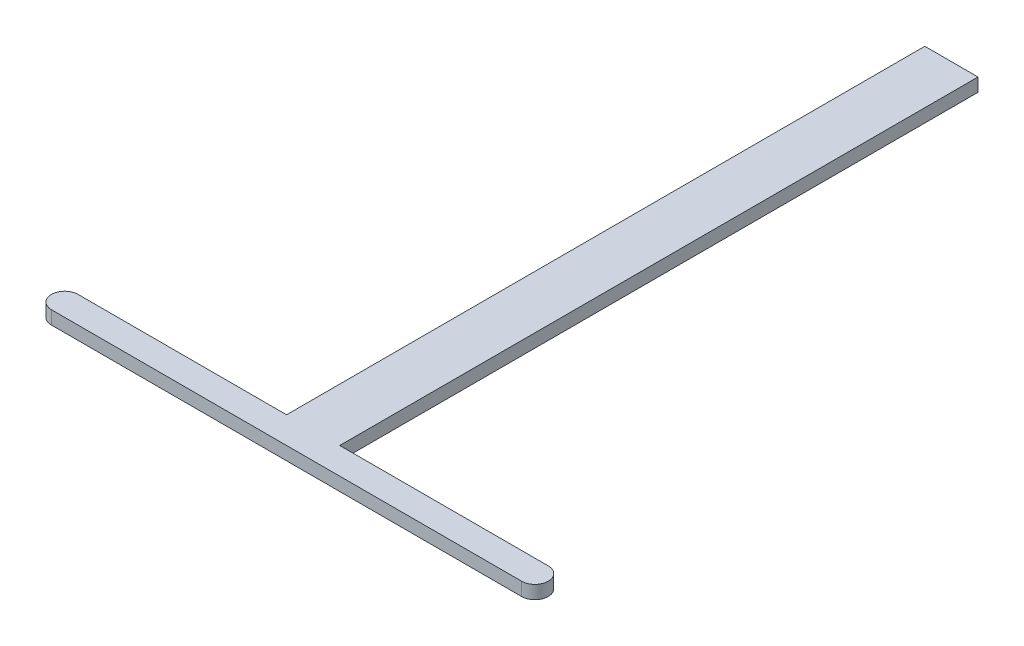
ISO-10303-21;
HEADER;
FILE_DESCRIPTION(('STEP AP214'),'2;1');
FILE_NAME('part.step','',(''),(''),'','','');
FILE_SCHEMA(('AUTOMOTIVE_DESIGN { 1 0 10303 214 1 1 1 1 }'));
ENDSEC;
DATA;
#1=APPLICATION_CONTEXT('core data for automotive mechanical design processes');
#2=APPLICATION_PROTOCOL_DEFINITION('international standard','automotive_design',2000,#1);
#3=PRODUCT_CONTEXT('',#1,'mechanical');
#4=PRODUCT('Part','Part','',(#3));
#5=PRODUCT_RELATED_PRODUCT_CATEGORY('part','',(#4));
#6=PRODUCT_DEFINITION_FORMATION('','',#4);
#7=PRODUCT_DEFINITION_CONTEXT('part definition',#1,'design');
#8=PRODUCT_DEFINITION('design','',#6,#7);
#9=PRODUCT_DEFINITION_SHAPE('','',#8);
#10=(LENGTH_UNIT() NAMED_UNIT(*) SI_UNIT(.MILLI.,.METRE.));
#11=(NAMED_UNIT(*) PLANE_ANGLE_UNIT() SI_UNIT($,.RADIAN.));
#12=(NAMED_UNIT(*) SI_UNIT($,.STERADIAN.) SOLID_ANGLE_UNIT());
#13=UNCERTAINTY_MEASURE_WITH_UNIT(LENGTH_MEASURE(1.E-05),#10,'distance_accuracy_value','');
#14=(GEOMETRIC_REPRESENTATION_CONTEXT(3) GLOBAL_UNCERTAINTY_ASSIGNED_CONTEXT((#13)) GLOBAL_UNIT_ASSIGNED_CONTEXT((#10,
#11,#12)) REPRESENTATION_CONTEXT('',''));
#15=CARTESIAN_POINT('',(0.,0.,0.));
#16=DIRECTION('',(0.,0.,1.));
#17=DIRECTION('',(1.,0.,0.));
#18=AXIS2_PLACEMENT_3D('',#15,#16,#17);
#19=CARTESIAN_POINT('',(-6.35000000000003,3.175,-152.4));
#20=DIRECTION('',(1.,0.,0.));
#21=DIRECTION('',(0.,0.,-1.));
#22=AXIS2_PLACEMENT_3D('',#19,#20,#21);
#23=PLANE('',#22);
#24=DIRECTION('',(0.,0.,1.));
#25=VECTOR('',#24,1.);
#26=CARTESIAN_POINT('',(-6.35000000000003,0.,-152.4));
#27=LINE('',#26,#25);
#28=CARTESIAN_POINT('',(-6.35000000000003,0.,-152.4));
#29=VERTEX_POINT('',#28);
#30=CARTESIAN_POINT('',(-6.34999999999999,0.,0.));
#31=VERTEX_POINT('',#30);
#32=EDGE_CURVE('E128',#29,#31,#27,.T.);
#33=ORIENTED_EDGE('',*,*,#32,.T.);
#34=DIRECTION('',(0.,-1.,0.));
#35=VECTOR('',#34,1.);
#36=CARTESIAN_POINT('',(-6.34999999999999,3.175,0.));
#37=LINE('',#36,#35);
#38=CARTESIAN_POINT('',(-6.34999999999999,3.175,0.));
#39=VERTEX_POINT('',#38);
#40=EDGE_CURVE('E11',#39,#31,#37,.T.);
#41=ORIENTED_EDGE('',*,*,#40,.F.);
#42=DIRECTION('',(0.,0.,1.));
#43=VECTOR('',#42,1.);
#44=CARTESIAN_POINT('',(-6.35000000000003,3.175,-152.4));
#45=LINE('',#44,#43);
#46=CARTESIAN_POINT('',(-6.35000000000003,3.175,-152.4));
#47=VERTEX_POINT('',#46);
#48=EDGE_CURVE('E142',#47,#39,#45,.T.);
#49=ORIENTED_EDGE('',*,*,#48,.F.);
#50=DIRECTION('',(0.,-1.,0.));
#51=VECTOR('',#50,1.);
#52=CARTESIAN_POINT('',(-6.35000000000003,3.175,-152.4));
#53=LINE('',#52,#51);
#54=EDGE_CURVE('E124',#47,#29,#53,.T.);
#55=ORIENTED_EDGE('',*,*,#54,.T.);
#56=EDGE_LOOP('',(#33,#41,#49,#55));
#57=FACE_BOUND('',#56,.T.);
#58=ADVANCED_FACE('F32',(#57),#23,.F.);
#59=CARTESIAN_POINT('',(-6.34999999999999,3.175,0.));
#60=DIRECTION('',(0.,0.,1.));
#61=DIRECTION('',(1.,0.,0.));
#62=AXIS2_PLACEMENT_3D('',#59,#60,#61);
#63=PLANE('',#62);
#64=DIRECTION('',(-1.,0.,0.));
#65=VECTOR('',#64,1.);
#66=CARTESIAN_POINT('',(-6.34999999999999,0.,0.));
#67=LINE('',#66,#65);
#68=CARTESIAN_POINT('',(-56.134,0.,0.));
#69=VERTEX_POINT('',#68);
#70=EDGE_CURVE('E131',#31,#69,#67,.T.);
#71=ORIENTED_EDGE('',*,*,#70,.T.);
#72=DIRECTION('',(0.,-1.,0.));
#73=VECTOR('',#72,1.);
#74=CARTESIAN_POINT('',(-56.134,3.175,0.));
#75=LINE('',#74,#73);
#76=CARTESIAN_POINT('',(-56.134,3.175,0.));
#77=VERTEX_POINT('',#76);
#78=EDGE_CURVE('E40',#77,#69,#75,.T.);
#79=ORIENTED_EDGE('',*,*,#78,.F.);
#80=DIRECTION('',(-1.,0.,0.));
#81=VECTOR('',#80,1.);
#82=CARTESIAN_POINT('',(-6.34999999999999,3.175,0.));
#83=LINE('',#82,#81);
#84=EDGE_CURVE('E91',#39,#77,#83,.T.);
#85=ORIENTED_EDGE('',*,*,#84,.F.);
#86=ORIENTED_EDGE('',*,*,#40,.T.);
#87=EDGE_LOOP('',(#71,#79,#85,#86));
#88=FACE_BOUND('',#87,.T.);
#89=ADVANCED_FACE('F177',(#88),#63,.F.);
#90=CARTESIAN_POINT('',(-56.134,3.175,3.17500000000001));
#91=DIRECTION('',(0.,-1.,0.));
#92=DIRECTION('',(0.,0.,-1.));
#93=AXIS2_PLACEMENT_3D('',#90,#91,#92);
#94=CYLINDRICAL_SURFACE('',#93,3.175);
#95=CARTESIAN_POINT('',(-56.134,0.,3.17500000000001));
#96=DIRECTION('',(0.,1.,0.));
#97=DIRECTION('',(0.,0.,1.));
#98=AXIS2_PLACEMENT_3D('',#95,#96,#97);
#99=CIRCLE('',#98,3.175);
#100=CARTESIAN_POINT('',(-56.134,0.,6.35000000000001));
#101=VERTEX_POINT('',#100);
#102=EDGE_CURVE('E133',#69,#101,#99,.T.);
#103=ORIENTED_EDGE('',*,*,#102,.T.);
#104=DIRECTION('',(0.,-1.,0.));
#105=VECTOR('',#104,1.);
#106=CARTESIAN_POINT('',(-56.134,3.175,6.35000000000001));
#107=LINE('',#106,#105);
#108=CARTESIAN_POINT('',(-56.134,3.175,6.35000000000001));
#109=VERTEX_POINT('',#108);
#110=EDGE_CURVE('E149',#109,#101,#107,.T.);
#111=ORIENTED_EDGE('',*,*,#110,.F.);
#112=CARTESIAN_POINT('',(-56.134,3.175,3.17500000000001));
#113=DIRECTION('',(0.,1.,0.));
#114=DIRECTION('',(0.,0.,1.));
#115=AXIS2_PLACEMENT_3D('',#112,#113,#114);
#116=CIRCLE('',#115,3.175);
#117=EDGE_CURVE('E157',#77,#109,#116,.T.);
#118=ORIENTED_EDGE('',*,*,#117,.F.);
#119=ORIENTED_EDGE('',*,*,#78,.T.);
#120=EDGE_LOOP('',(#103,#111,#118,#119));
#121=FACE_BOUND('',#120,.T.);
#122=ADVANCED_FACE('F155',(#121),#94,.T.);
#123=CARTESIAN_POINT('',(56.134,3.175,6.34999999999998));
#124=DIRECTION('',(0.,0.,-1.));
#125=DIRECTION('',(-1.,0.,0.));
#126=AXIS2_PLACEMENT_3D('',#123,#124,#125);
#127=PLANE('',#126);
#128=DIRECTION('',(1.,0.,0.));
#129=VECTOR('',#128,1.);
#130=CARTESIAN_POINT('',(56.134,0.,6.34999999999998));
#131=LINE('',#130,#129);
#132=CARTESIAN_POINT('',(56.134,0.,6.34999999999998));
#133=VERTEX_POINT('',#132);
#134=EDGE_CURVE('E135',#101,#133,#131,.T.);
#135=ORIENTED_EDGE('',*,*,#134,.T.);
#136=DIRECTION('',(0.,-1.,0.));
#137=VECTOR('',#136,1.);
#138=CARTESIAN_POINT('',(56.134,3.175,6.34999999999998));
#139=LINE('',#138,#137);
#140=CARTESIAN_POINT('',(56.134,3.175,6.34999999999998));
#141=VERTEX_POINT('',#140);
#142=EDGE_CURVE('E146',#141,#133,#139,.T.);
#143=ORIENTED_EDGE('',*,*,#142,.F.);
#144=DIRECTION('',(1.,0.,0.));
#145=VECTOR('',#144,1.);
#146=CARTESIAN_POINT('',(56.134,3.175,6.34999999999998));
#147=LINE('',#146,#145);
#148=EDGE_CURVE('E169',#109,#141,#147,.T.);
#149=ORIENTED_EDGE('',*,*,#148,.F.);
#150=ORIENTED_EDGE('',*,*,#110,.T.);
#151=EDGE_LOOP('',(#135,#143,#149,#150));
#152=FACE_BOUND('',#151,.T.);
#153=ADVANCED_FACE('F165',(#152),#127,.F.);
#154=CARTESIAN_POINT('',(56.134,3.175,3.17499999999998));
#155=DIRECTION('',(0.,-1.,0.));
#156=DIRECTION('',(0.,0.,-1.));
#157=AXIS2_PLACEMENT_3D('',#154,#155,#156);
#158=CYLINDRICAL_SURFACE('',#157,3.175);
#159=CARTESIAN_POINT('',(56.134,0.,3.17499999999998));
#160=DIRECTION('',(0.,1.,0.));
#161=DIRECTION('',(0.,0.,1.));
#162=AXIS2_PLACEMENT_3D('',#159,#160,#161);
#163=CIRCLE('',#162,3.175);
#164=CARTESIAN_POINT('',(56.134,0.,0.));
#165=VERTEX_POINT('',#164);
#166=EDGE_CURVE('E137',#133,#165,#163,.T.);
#167=ORIENTED_EDGE('',*,*,#166,.T.);
#168=DIRECTION('',(0.,-1.,0.));
#169=VECTOR('',#168,1.);
#170=CARTESIAN_POINT('',(56.134,3.175,0.));
#171=LINE('',#170,#169);
#172=CARTESIAN_POINT('',(56.134,3.175,0.));
#173=VERTEX_POINT('',#172);
#174=EDGE_CURVE('E119',#173,#165,#171,.T.);
#175=ORIENTED_EDGE('',*,*,#174,.F.);
#176=CARTESIAN_POINT('',(56.134,3.175,3.17499999999998));
#177=DIRECTION('',(0.,1.,0.));
#178=DIRECTION('',(0.,0.,1.));
#179=AXIS2_PLACEMENT_3D('',#176,#177,#178);
#180=CIRCLE('',#179,3.175);
#181=EDGE_CURVE('E110',#141,#173,#180,.T.);
#182=ORIENTED_EDGE('',*,*,#181,.F.);
#183=ORIENTED_EDGE('',*,*,#142,.T.);
#184=EDGE_LOOP('',(#167,#175,#182,#183));
#185=FACE_BOUND('',#184,.T.);
#186=ADVANCED_FACE('F168',(#185),#158,.T.);
#187=CARTESIAN_POINT('',(56.134,3.175,0.));
#188=DIRECTION('',(0.,0.,1.));
#189=DIRECTION('',(1.,0.,0.));
#190=AXIS2_PLACEMENT_3D('',#187,#188,#189);
#191=PLANE('',#190);
#192=DIRECTION('',(-1.,0.,0.));
#193=VECTOR('',#192,1.);
#194=CARTESIAN_POINT('',(56.134,0.,0.));
#195=LINE('',#194,#193);
#196=CARTESIAN_POINT('',(6.34999999999999,0.,0.));
#197=VERTEX_POINT('',#196);
#198=EDGE_CURVE('E118',#165,#197,#195,.T.);
#199=ORIENTED_EDGE('',*,*,#198,.T.);
#200=DIRECTION('',(0.,-1.,0.));
#201=VECTOR('',#200,1.);
#202=CARTESIAN_POINT('',(6.34999999999999,3.175,0.));
#203=LINE('',#202,#201);
#204=CARTESIAN_POINT('',(6.34999999999999,3.175,0.));
#205=VERTEX_POINT('',#204);
#206=EDGE_CURVE('E115',#205,#197,#203,.T.);
#207=ORIENTED_EDGE('',*,*,#206,.F.);
#208=DIRECTION('',(-1.,0.,0.));
#209=VECTOR('',#208,1.);
#210=CARTESIAN_POINT('',(56.134,3.175,0.));
#211=LINE('',#210,#209);
#212=EDGE_CURVE('E104',#173,#205,#211,.T.);
#213=ORIENTED_EDGE('',*,*,#212,.F.);
#214=ORIENTED_EDGE('',*,*,#174,.T.);
#215=EDGE_LOOP('',(#199,#207,#213,#214));
#216=FACE_BOUND('',#215,.T.);
#217=ADVANCED_FACE('F116',(#216),#191,.F.);
#218=CARTESIAN_POINT('',(6.34999999999998,3.175,-152.4));
#219=DIRECTION('',(-1.,0.,0.));
#220=DIRECTION('',(0.,0.,1.));
#221=AXIS2_PLACEMENT_3D('',#218,#219,#220);
#222=PLANE('',#221);
#223=DIRECTION('',(0.,0.,-1.));
#224=VECTOR('',#223,1.);
#225=CARTESIAN_POINT('',(6.34999999999998,0.,-152.4));
#226=LINE('',#225,#224);
#227=CARTESIAN_POINT('',(6.34999999999998,0.,-152.4));
#228=VERTEX_POINT('',#227);
#229=EDGE_CURVE('E77',#197,#228,#226,.T.);
#230=ORIENTED_EDGE('',*,*,#229,.T.);
#231=DIRECTION('',(0.,-1.,0.));
#232=VECTOR('',#231,1.);
#233=CARTESIAN_POINT('',(6.34999999999998,3.175,-152.4));
#234=LINE('',#233,#232);
#235=CARTESIAN_POINT('',(6.34999999999998,3.175,-152.4));
#236=VERTEX_POINT('',#235);
#237=EDGE_CURVE('E120',#236,#228,#234,.T.);
#238=ORIENTED_EDGE('',*,*,#237,.F.);
#239=DIRECTION('',(0.,0.,-1.));
#240=VECTOR('',#239,1.);
#241=CARTESIAN_POINT('',(6.34999999999998,3.175,-152.4));
#242=LINE('',#241,#240);
#243=EDGE_CURVE('E108',#205,#236,#242,.T.);
#244=ORIENTED_EDGE('',*,*,#243,.F.);
#245=ORIENTED_EDGE('',*,*,#206,.T.);
#246=EDGE_LOOP('',(#230,#238,#244,#245));
#247=FACE_BOUND('',#246,.T.);
#248=ADVANCED_FACE('F122',(#247),#222,.F.);
#249=CARTESIAN_POINT('',(-6.35000000000003,3.175,-152.4));
#250=DIRECTION('',(0.,0.,1.));
#251=DIRECTION('',(1.,0.,0.));
#252=AXIS2_PLACEMENT_3D('',#249,#250,#251);
#253=PLANE('',#252);
#254=DIRECTION('',(-1.,0.,0.));
#255=VECTOR('',#254,1.);
#256=CARTESIAN_POINT('',(-6.35000000000003,0.,-152.4));
#257=LINE('',#256,#255);
#258=EDGE_CURVE('E83',#228,#29,#257,.T.);
#259=ORIENTED_EDGE('',*,*,#258,.T.);
#260=ORIENTED_EDGE('',*,*,#54,.F.);
#261=DIRECTION('',(-1.,0.,0.));
#262=VECTOR('',#261,1.);
#263=CARTESIAN_POINT('',(-6.35000000000003,3.175,-152.4));
#264=LINE('',#263,#262);
#265=EDGE_CURVE('E48',#236,#47,#264,.T.);
#266=ORIENTED_EDGE('',*,*,#265,.F.);
#267=ORIENTED_EDGE('',*,*,#237,.T.);
#268=EDGE_LOOP('',(#259,#260,#266,#267));
#269=FACE_BOUND('',#268,.T.);
#270=ADVANCED_FACE('F193',(#269),#253,.F.);
#271=CARTESIAN_POINT('',(-56.134,3.175,3.17500000000001));
#272=DIRECTION('',(0.,1.,0.));
#273=DIRECTION('',(0.,0.,1.));
#274=AXIS2_PLACEMENT_3D('',#271,#272,#273);
#275=PLANE('',#274);
#276=ORIENTED_EDGE('',*,*,#48,.T.);
#277=ORIENTED_EDGE('',*,*,#84,.T.);
#278=ORIENTED_EDGE('',*,*,#117,.T.);
#279=ORIENTED_EDGE('',*,*,#148,.T.);
#280=ORIENTED_EDGE('',*,*,#181,.T.);
#281=ORIENTED_EDGE('',*,*,#212,.T.);
#282=ORIENTED_EDGE('',*,*,#243,.T.);
#283=ORIENTED_EDGE('',*,*,#265,.T.);
#284=EDGE_LOOP('',(#276,#277,#278,#279,#280,#281,#282,#283));
#285=FACE_BOUND('',#284,.T.);
#286=ADVANCED_FACE('F106',(#285),#275,.T.);
#287=CARTESIAN_POINT('',(-56.134,0.,3.17500000000001));
#288=DIRECTION('',(0.,1.,0.));
#289=DIRECTION('',(0.,0.,1.));
#290=AXIS2_PLACEMENT_3D('',#287,#288,#289);
#291=PLANE('',#290);
#292=ORIENTED_EDGE('',*,*,#32,.F.);
#293=ORIENTED_EDGE('',*,*,#258,.F.);
#294=ORIENTED_EDGE('',*,*,#229,.F.);
#295=ORIENTED_EDGE('',*,*,#198,.F.);
#296=ORIENTED_EDGE('',*,*,#166,.F.);
#297=ORIENTED_EDGE('',*,*,#134,.F.);
#298=ORIENTED_EDGE('',*,*,#102,.F.);
#299=ORIENTED_EDGE('',*,*,#70,.F.);
#300=EDGE_LOOP('',(#292,#293,#294,#295,#296,#297,#298,#299));
#301=FACE_BOUND('',#300,.T.);
#302=ADVANCED_FACE('F161',(#301),#291,.F.);
#303=CLOSED_SHELL('',(#58,#89,#122,#153,#186,#217,#248,#270,#286,#302));
#304=MANIFOLD_SOLID_BREP('B2',#303);
#305=ADVANCED_BREP_SHAPE_REPRESENTATION('',(#18,#304),#14);
#306=SHAPE_DEFINITION_REPRESENTATION(#9,#305);
ENDSEC;
END-ISO-10303-21;
